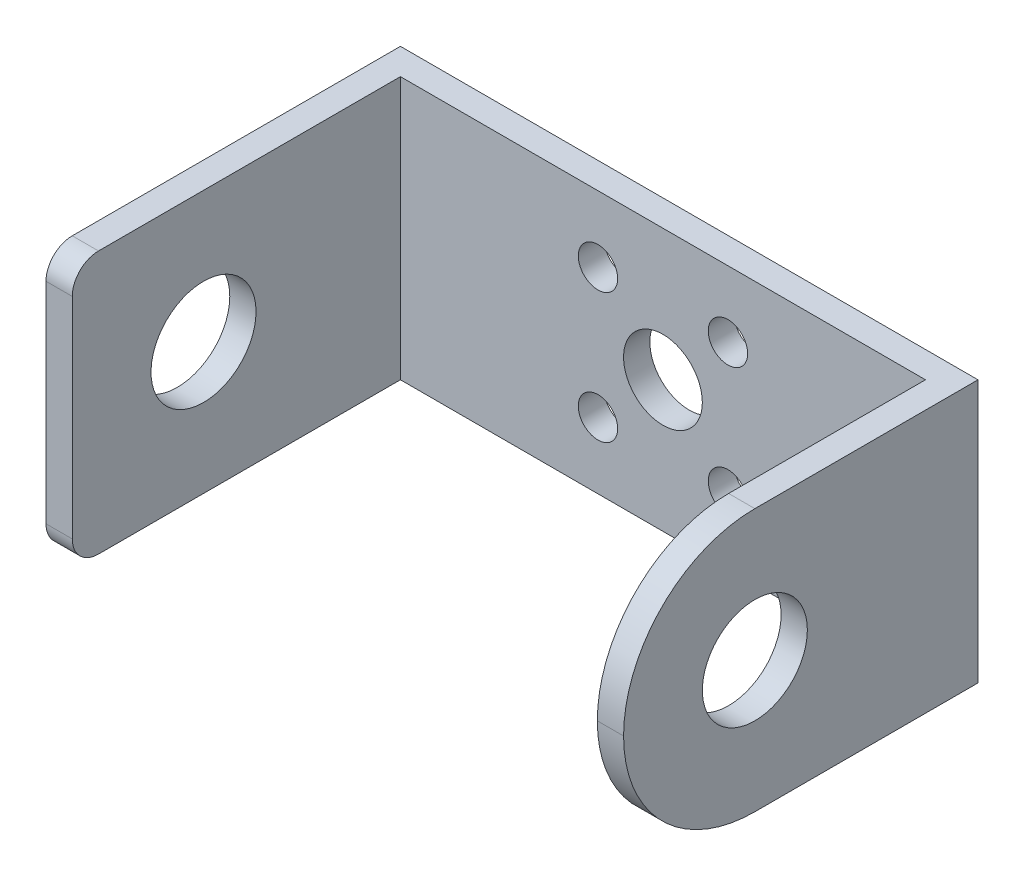
ISO-10303-21;
HEADER;
FILE_DESCRIPTION(('STEP AP214'),'2;1');
FILE_NAME('part.step','',(''),(''),'','','');
FILE_SCHEMA(('AUTOMOTIVE_DESIGN { 1 0 10303 214 1 1 1 1 }'));
ENDSEC;
DATA;
#1=APPLICATION_CONTEXT('core data for automotive mechanical design processes');
#2=APPLICATION_PROTOCOL_DEFINITION('international standard','automotive_design',2000,#1);
#3=PRODUCT_CONTEXT('',#1,'mechanical');
#4=PRODUCT('Part','Part','',(#3));
#5=PRODUCT_RELATED_PRODUCT_CATEGORY('part','',(#4));
#6=PRODUCT_DEFINITION_FORMATION('','',#4);
#7=PRODUCT_DEFINITION_CONTEXT('part definition',#1,'design');
#8=PRODUCT_DEFINITION('design','',#6,#7);
#9=PRODUCT_DEFINITION_SHAPE('','',#8);
#10=(LENGTH_UNIT() NAMED_UNIT(*) SI_UNIT(.MILLI.,.METRE.));
#11=(NAMED_UNIT(*) PLANE_ANGLE_UNIT() SI_UNIT($,.RADIAN.));
#12=(NAMED_UNIT(*) SI_UNIT($,.STERADIAN.) SOLID_ANGLE_UNIT());
#13=UNCERTAINTY_MEASURE_WITH_UNIT(LENGTH_MEASURE(1.E-05),#10,'distance_accuracy_value','');
#14=(GEOMETRIC_REPRESENTATION_CONTEXT(3) GLOBAL_UNCERTAINTY_ASSIGNED_CONTEXT((#13)) GLOBAL_UNIT_ASSIGNED_CONTEXT((#10,
#11,#12)) REPRESENTATION_CONTEXT('',''));
#15=CARTESIAN_POINT('',(0.,0.,0.));
#16=DIRECTION('',(0.,0.,1.));
#17=DIRECTION('',(1.,0.,0.));
#18=AXIS2_PLACEMENT_3D('',#15,#16,#17);
#19=CARTESIAN_POINT('',(0.,0.,2.));
#20=DIRECTION('',(0.,0.,-1.));
#21=DIRECTION('',(-1.,0.,0.));
#22=AXIS2_PLACEMENT_3D('',#19,#20,#21);
#23=PLANE('',#22);
#24=CARTESIAN_POINT('',(-4.94974746830583,-4.94974746830584,2.));
#25=DIRECTION('',(0.,0.,1.));
#26=DIRECTION('',(-1.,0.,0.));
#27=AXIS2_PLACEMENT_3D('',#24,#25,#26);
#28=CIRCLE('',#27,1.5);
#29=CARTESIAN_POINT('',(-6.44974746830583,-4.94974746830584,2.));
#30=VERTEX_POINT('',#29);
#31=EDGE_CURVE('E147',#30,#30,#28,.T.);
#32=ORIENTED_EDGE('',*,*,#31,.F.);
#33=EDGE_LOOP('',(#32));
#34=FACE_BOUND('',#33,.T.);
#35=CARTESIAN_POINT('',(4.94974746830582,-4.94974746830584,2.));
#36=DIRECTION('',(0.,0.,1.));
#37=DIRECTION('',(1.,0.,0.));
#38=AXIS2_PLACEMENT_3D('',#35,#36,#37);
#39=CIRCLE('',#38,1.5);
#40=CARTESIAN_POINT('',(6.44974746830582,-4.94974746830584,2.));
#41=VERTEX_POINT('',#40);
#42=EDGE_CURVE('E164',#41,#41,#39,.T.);
#43=ORIENTED_EDGE('',*,*,#42,.F.);
#44=EDGE_LOOP('',(#43));
#45=FACE_BOUND('',#44,.T.);
#46=CARTESIAN_POINT('',(4.94974746830582,4.94974746830583,2.));
#47=DIRECTION('',(0.,0.,1.));
#48=DIRECTION('',(-1.,0.,0.));
#49=AXIS2_PLACEMENT_3D('',#46,#47,#48);
#50=CIRCLE('',#49,1.5);
#51=CARTESIAN_POINT('',(3.44974746830582,4.94974746830583,2.));
#52=VERTEX_POINT('',#51);
#53=EDGE_CURVE('E158',#52,#52,#50,.T.);
#54=ORIENTED_EDGE('',*,*,#53,.F.);
#55=EDGE_LOOP('',(#54));
#56=FACE_BOUND('',#55,.T.);
#57=CARTESIAN_POINT('',(-4.94974746830583,4.94974746830583,2.));
#58=DIRECTION('',(0.,0.,1.));
#59=DIRECTION('',(1.,0.,0.));
#60=AXIS2_PLACEMENT_3D('',#57,#58,#59);
#61=CIRCLE('',#60,1.5);
#62=CARTESIAN_POINT('',(-3.44974746830583,4.94974746830583,2.));
#63=VERTEX_POINT('',#62);
#64=EDGE_CURVE('E152',#63,#63,#61,.T.);
#65=ORIENTED_EDGE('',*,*,#64,.F.);
#66=EDGE_LOOP('',(#65));
#67=FACE_BOUND('',#66,.T.);
#68=CARTESIAN_POINT('',(0.,0.,2.));
#69=DIRECTION('',(0.,0.,1.));
#70=DIRECTION('',(1.,0.,0.));
#71=AXIS2_PLACEMENT_3D('',#68,#69,#70);
#72=CIRCLE('',#71,3.);
#73=CARTESIAN_POINT('',(3.,0.,2.));
#74=VERTEX_POINT('',#73);
#75=EDGE_CURVE('E151',#74,#74,#72,.T.);
#76=ORIENTED_EDGE('',*,*,#75,.F.);
#77=EDGE_LOOP('',(#76));
#78=FACE_BOUND('',#77,.T.);
#79=DIRECTION('',(0.,-1.,0.));
#80=VECTOR('',#79,1.);
#81=CARTESIAN_POINT('',(20.,10.,2.));
#82=LINE('',#81,#80);
#83=CARTESIAN_POINT('',(20.,10.,2.));
#84=VERTEX_POINT('',#83);
#85=CARTESIAN_POINT('',(20.,-10.,2.));
#86=VERTEX_POINT('',#85);
#87=EDGE_CURVE('E132',#84,#86,#82,.T.);
#88=ORIENTED_EDGE('',*,*,#87,.F.);
#89=DIRECTION('',(-1.,0.,0.));
#90=VECTOR('',#89,1.);
#91=CARTESIAN_POINT('',(-22.,10.,2.));
#92=LINE('',#91,#90);
#93=CARTESIAN_POINT('',(-20.,10.,2.));
#94=VERTEX_POINT('',#93);
#95=EDGE_CURVE('E119',#84,#94,#92,.T.);
#96=ORIENTED_EDGE('',*,*,#95,.T.);
#97=DIRECTION('',(0.,1.,0.));
#98=VECTOR('',#97,1.);
#99=CARTESIAN_POINT('',(-20.,10.,2.));
#100=LINE('',#99,#98);
#101=CARTESIAN_POINT('',(-20.,-10.,2.));
#102=VERTEX_POINT('',#101);
#103=EDGE_CURVE('E129',#102,#94,#100,.T.);
#104=ORIENTED_EDGE('',*,*,#103,.F.);
#105=DIRECTION('',(1.,0.,0.));
#106=VECTOR('',#105,1.);
#107=CARTESIAN_POINT('',(-22.,-10.,2.));
#108=LINE('',#107,#106);
#109=EDGE_CURVE('E133',#102,#86,#108,.T.);
#110=ORIENTED_EDGE('',*,*,#109,.T.);
#111=EDGE_LOOP('',(#88,#96,#104,#110));
#112=FACE_BOUND('',#111,.T.);
#113=ADVANCED_FACE('F33',(#34,#45,#56,#67,#78,#112),#23,.F.);
#114=CARTESIAN_POINT('',(22.,-10.,2.));
#115=DIRECTION('',(-1.,0.,0.));
#116=DIRECTION('',(0.,0.,1.));
#117=AXIS2_PLACEMENT_3D('',#114,#115,#116);
#118=PLANE('',#117);
#119=CARTESIAN_POINT('',(22.,0.,17.));
#120=DIRECTION('',(1.,0.,0.));
#121=DIRECTION('',(0.,0.,-1.));
#122=AXIS2_PLACEMENT_3D('',#119,#120,#121);
#123=CIRCLE('',#122,4.);
#124=CARTESIAN_POINT('',(22.,0.,13.));
#125=VERTEX_POINT('',#124);
#126=EDGE_CURVE('E261',#125,#125,#123,.T.);
#127=ORIENTED_EDGE('',*,*,#126,.F.);
#128=EDGE_LOOP('',(#127));
#129=FACE_BOUND('',#128,.T.);
#130=DIRECTION('',(0.,0.,-1.));
#131=VECTOR('',#130,1.);
#132=CARTESIAN_POINT('',(22.,10.,2.));
#133=LINE('',#132,#131);
#134=CARTESIAN_POINT('',(22.,10.,17.));
#135=VERTEX_POINT('',#134);
#136=CARTESIAN_POINT('',(22.,10.,0.));
#137=VERTEX_POINT('',#136);
#138=EDGE_CURVE('E195',#135,#137,#133,.T.);
#139=ORIENTED_EDGE('',*,*,#138,.F.);
#140=CARTESIAN_POINT('',(22.,0.,17.));
#141=DIRECTION('',(-1.,0.,0.));
#142=DIRECTION('',(0.,0.,1.));
#143=AXIS2_PLACEMENT_3D('',#140,#141,#142);
#144=CIRCLE('',#143,10.);
#145=CARTESIAN_POINT('',(22.,0.,27.));
#146=VERTEX_POINT('',#145);
#147=EDGE_CURVE('E206',#135,#146,#144,.F.);
#148=ORIENTED_EDGE('',*,*,#147,.T.);
#149=CARTESIAN_POINT('',(22.,0.,17.));
#150=DIRECTION('',(-1.,0.,0.));
#151=DIRECTION('',(0.,0.,1.));
#152=AXIS2_PLACEMENT_3D('',#149,#150,#151);
#153=CIRCLE('',#152,10.);
#154=CARTESIAN_POINT('',(22.,-10.,17.));
#155=VERTEX_POINT('',#154);
#156=EDGE_CURVE('E204',#146,#155,#153,.F.);
#157=ORIENTED_EDGE('',*,*,#156,.T.);
#158=DIRECTION('',(0.,0.,-1.));
#159=VECTOR('',#158,1.);
#160=CARTESIAN_POINT('',(22.,-10.,2.));
#161=LINE('',#160,#159);
#162=CARTESIAN_POINT('',(22.,-10.,0.));
#163=VERTEX_POINT('',#162);
#164=EDGE_CURVE('E179',#155,#163,#161,.T.);
#165=ORIENTED_EDGE('',*,*,#164,.T.);
#166=DIRECTION('',(0.,1.,0.));
#167=VECTOR('',#166,1.);
#168=CARTESIAN_POINT('',(22.,-10.,0.));
#169=LINE('',#168,#167);
#170=EDGE_CURVE('E175',#163,#137,#169,.T.);
#171=ORIENTED_EDGE('',*,*,#170,.T.);
#172=EDGE_LOOP('',(#139,#148,#157,#165,#171));
#173=FACE_BOUND('',#172,.T.);
#174=ADVANCED_FACE('F268',(#129,#173),#118,.F.);
#175=CARTESIAN_POINT('',(-22.,10.,2.));
#176=DIRECTION('',(0.,-1.,0.));
#177=DIRECTION('',(0.,0.,-1.));
#178=AXIS2_PLACEMENT_3D('',#175,#176,#177);
#179=PLANE('',#178);
#180=DIRECTION('',(0.,0.,-1.));
#181=VECTOR('',#180,1.);
#182=CARTESIAN_POINT('',(-22.,10.,2.));
#183=LINE('',#182,#181);
#184=CARTESIAN_POINT('',(-22.,10.,25.));
#185=VERTEX_POINT('',#184);
#186=CARTESIAN_POINT('',(-22.,10.,0.));
#187=VERTEX_POINT('',#186);
#188=EDGE_CURVE('E193',#185,#187,#183,.T.);
#189=ORIENTED_EDGE('',*,*,#188,.F.);
#190=DIRECTION('',(-1.,0.,0.));
#191=VECTOR('',#190,1.);
#192=CARTESIAN_POINT('',(-20.,10.,25.));
#193=LINE('',#192,#191);
#194=CARTESIAN_POINT('',(-20.,10.,25.));
#195=VERTEX_POINT('',#194);
#196=EDGE_CURVE('E57',#185,#195,#193,.F.);
#197=ORIENTED_EDGE('',*,*,#196,.T.);
#198=DIRECTION('',(0.,0.,-1.));
#199=VECTOR('',#198,1.);
#200=CARTESIAN_POINT('',(-20.,10.,27.));
#201=LINE('',#200,#199);
#202=EDGE_CURVE('E115',#195,#94,#201,.T.);
#203=ORIENTED_EDGE('',*,*,#202,.T.);
#204=ORIENTED_EDGE('',*,*,#95,.F.);
#205=DIRECTION('',(0.,0.,-1.));
#206=VECTOR('',#205,1.);
#207=CARTESIAN_POINT('',(20.,10.,27.));
#208=LINE('',#207,#206);
#209=CARTESIAN_POINT('',(20.,10.,17.));
#210=VERTEX_POINT('',#209);
#211=EDGE_CURVE('E138',#210,#84,#208,.T.);
#212=ORIENTED_EDGE('',*,*,#211,.F.);
#213=DIRECTION('',(-1.,0.,0.));
#214=VECTOR('',#213,1.);
#215=CARTESIAN_POINT('',(-22.,10.,17.));
#216=LINE('',#215,#214);
#217=EDGE_CURVE('E201',#210,#135,#216,.F.);
#218=ORIENTED_EDGE('',*,*,#217,.T.);
#219=ORIENTED_EDGE('',*,*,#138,.T.);
#220=DIRECTION('',(-1.,0.,0.));
#221=VECTOR('',#220,1.);
#222=CARTESIAN_POINT('',(-22.,10.,0.));
#223=LINE('',#222,#221);
#224=EDGE_CURVE('E182',#137,#187,#223,.T.);
#225=ORIENTED_EDGE('',*,*,#224,.T.);
#226=EDGE_LOOP('',(#189,#197,#203,#204,#212,#218,#219,#225));
#227=FACE_BOUND('',#226,.T.);
#228=ADVANCED_FACE('F117',(#227),#179,.F.);
#229=CARTESIAN_POINT('',(-22.,-10.,2.));
#230=DIRECTION('',(1.,0.,0.));
#231=DIRECTION('',(0.,0.,-1.));
#232=AXIS2_PLACEMENT_3D('',#229,#230,#231);
#233=PLANE('',#232);
#234=CARTESIAN_POINT('',(-22.,0.,17.));
#235=DIRECTION('',(1.,0.,0.));
#236=DIRECTION('',(0.,0.,-1.));
#237=AXIS2_PLACEMENT_3D('',#234,#235,#236);
#238=CIRCLE('',#237,4.);
#239=CARTESIAN_POINT('',(-22.,0.,13.));
#240=VERTEX_POINT('',#239);
#241=EDGE_CURVE('E258',#240,#240,#238,.F.);
#242=ORIENTED_EDGE('',*,*,#241,.F.);
#243=EDGE_LOOP('',(#242));
#244=FACE_BOUND('',#243,.T.);
#245=DIRECTION('',(0.,-1.,0.));
#246=VECTOR('',#245,1.);
#247=CARTESIAN_POINT('',(-22.,10.,27.));
#248=LINE('',#247,#246);
#249=CARTESIAN_POINT('',(-22.,8.,27.));
#250=VERTEX_POINT('',#249);
#251=CARTESIAN_POINT('',(-22.,-8.,27.));
#252=VERTEX_POINT('',#251);
#253=EDGE_CURVE('E137',#250,#252,#248,.T.);
#254=ORIENTED_EDGE('',*,*,#253,.F.);
#255=CARTESIAN_POINT('',(-22.,8.,25.));
#256=DIRECTION('',(1.,0.,0.));
#257=DIRECTION('',(0.,0.,-1.));
#258=AXIS2_PLACEMENT_3D('',#255,#256,#257);
#259=CIRCLE('',#258,2.);
#260=EDGE_CURVE('E222',#250,#185,#259,.F.);
#261=ORIENTED_EDGE('',*,*,#260,.T.);
#262=ORIENTED_EDGE('',*,*,#188,.T.);
#263=DIRECTION('',(0.,-1.,0.));
#264=VECTOR('',#263,1.);
#265=CARTESIAN_POINT('',(-22.,-10.,0.));
#266=LINE('',#265,#264);
#267=CARTESIAN_POINT('',(-22.,-10.,0.));
#268=VERTEX_POINT('',#267);
#269=EDGE_CURVE('E185',#187,#268,#266,.T.);
#270=ORIENTED_EDGE('',*,*,#269,.T.);
#271=DIRECTION('',(0.,0.,-1.));
#272=VECTOR('',#271,1.);
#273=CARTESIAN_POINT('',(-22.,-10.,2.));
#274=LINE('',#273,#272);
#275=CARTESIAN_POINT('',(-22.,-10.,25.));
#276=VERTEX_POINT('',#275);
#277=EDGE_CURVE('E191',#276,#268,#274,.T.);
#278=ORIENTED_EDGE('',*,*,#277,.F.);
#279=CARTESIAN_POINT('',(-22.,-8.,25.));
#280=DIRECTION('',(1.,0.,0.));
#281=DIRECTION('',(0.,0.,-1.));
#282=AXIS2_PLACEMENT_3D('',#279,#280,#281);
#283=CIRCLE('',#282,2.);
#284=EDGE_CURVE('E220',#276,#252,#283,.F.);
#285=ORIENTED_EDGE('',*,*,#284,.T.);
#286=EDGE_LOOP('',(#254,#261,#262,#270,#278,#285));
#287=FACE_BOUND('',#286,.T.);
#288=ADVANCED_FACE('F235',(#244,#287),#233,.F.);
#289=CARTESIAN_POINT('',(-22.,-10.,2.));
#290=DIRECTION('',(0.,1.,0.));
#291=DIRECTION('',(0.,0.,1.));
#292=AXIS2_PLACEMENT_3D('',#289,#290,#291);
#293=PLANE('',#292);
#294=DIRECTION('',(0.,0.,-1.));
#295=VECTOR('',#294,1.);
#296=CARTESIAN_POINT('',(-20.,-10.,27.));
#297=LINE('',#296,#295);
#298=CARTESIAN_POINT('',(-20.,-10.,25.));
#299=VERTEX_POINT('',#298);
#300=EDGE_CURVE('E122',#299,#102,#297,.T.);
#301=ORIENTED_EDGE('',*,*,#300,.F.);
#302=DIRECTION('',(1.,0.,0.));
#303=VECTOR('',#302,1.);
#304=CARTESIAN_POINT('',(-22.,-10.,25.));
#305=LINE('',#304,#303);
#306=EDGE_CURVE('E11',#299,#276,#305,.F.);
#307=ORIENTED_EDGE('',*,*,#306,.T.);
#308=ORIENTED_EDGE('',*,*,#277,.T.);
#309=DIRECTION('',(1.,0.,0.));
#310=VECTOR('',#309,1.);
#311=CARTESIAN_POINT('',(-22.,-10.,0.));
#312=LINE('',#311,#310);
#313=EDGE_CURVE('E134',#268,#163,#312,.T.);
#314=ORIENTED_EDGE('',*,*,#313,.T.);
#315=ORIENTED_EDGE('',*,*,#164,.F.);
#316=DIRECTION('',(1.,0.,0.));
#317=VECTOR('',#316,1.);
#318=CARTESIAN_POINT('',(-22.,-10.,17.));
#319=LINE('',#318,#317);
#320=CARTESIAN_POINT('',(20.,-10.,17.));
#321=VERTEX_POINT('',#320);
#322=EDGE_CURVE('E208',#155,#321,#319,.F.);
#323=ORIENTED_EDGE('',*,*,#322,.T.);
#324=DIRECTION('',(0.,0.,-1.));
#325=VECTOR('',#324,1.);
#326=CARTESIAN_POINT('',(20.,-10.,27.));
#327=LINE('',#326,#325);
#328=EDGE_CURVE('E142',#321,#86,#327,.T.);
#329=ORIENTED_EDGE('',*,*,#328,.T.);
#330=ORIENTED_EDGE('',*,*,#109,.F.);
#331=EDGE_LOOP('',(#301,#307,#308,#314,#315,#323,#329,#330));
#332=FACE_BOUND('',#331,.T.);
#333=ADVANCED_FACE('F248',(#332),#293,.F.);
#334=CARTESIAN_POINT('',(0.,0.,0.));
#335=DIRECTION('',(0.,0.,-1.));
#336=DIRECTION('',(-1.,0.,0.));
#337=AXIS2_PLACEMENT_3D('',#334,#335,#336);
#338=PLANE('',#337);
#339=CARTESIAN_POINT('',(-4.94974746830583,-4.94974746830584,0.));
#340=DIRECTION('',(0.,0.,1.));
#341=DIRECTION('',(-1.,0.,0.));
#342=AXIS2_PLACEMENT_3D('',#339,#340,#341);
#343=CIRCLE('',#342,1.5);
#344=CARTESIAN_POINT('',(-6.44974746830583,-4.94974746830584,0.));
#345=VERTEX_POINT('',#344);
#346=EDGE_CURVE('E167',#345,#345,#343,.T.);
#347=ORIENTED_EDGE('',*,*,#346,.T.);
#348=EDGE_LOOP('',(#347));
#349=FACE_BOUND('',#348,.T.);
#350=CARTESIAN_POINT('',(4.94974746830582,-4.94974746830584,0.));
#351=DIRECTION('',(0.,0.,1.));
#352=DIRECTION('',(1.,0.,0.));
#353=AXIS2_PLACEMENT_3D('',#350,#351,#352);
#354=CIRCLE('',#353,1.5);
#355=CARTESIAN_POINT('',(6.44974746830582,-4.94974746830584,0.));
#356=VERTEX_POINT('',#355);
#357=EDGE_CURVE('E161',#356,#356,#354,.T.);
#358=ORIENTED_EDGE('',*,*,#357,.T.);
#359=EDGE_LOOP('',(#358));
#360=FACE_BOUND('',#359,.T.);
#361=CARTESIAN_POINT('',(4.94974746830582,4.94974746830583,0.));
#362=DIRECTION('',(0.,0.,1.));
#363=DIRECTION('',(-1.,0.,0.));
#364=AXIS2_PLACEMENT_3D('',#361,#362,#363);
#365=CIRCLE('',#364,1.5);
#366=CARTESIAN_POINT('',(3.44974746830582,4.94974746830583,0.));
#367=VERTEX_POINT('',#366);
#368=EDGE_CURVE('E155',#367,#367,#365,.T.);
#369=ORIENTED_EDGE('',*,*,#368,.T.);
#370=EDGE_LOOP('',(#369));
#371=FACE_BOUND('',#370,.T.);
#372=CARTESIAN_POINT('',(-4.94974746830583,4.94974746830583,0.));
#373=DIRECTION('',(0.,0.,1.));
#374=DIRECTION('',(1.,0.,0.));
#375=AXIS2_PLACEMENT_3D('',#372,#373,#374);
#376=CIRCLE('',#375,1.5);
#377=CARTESIAN_POINT('',(-3.44974746830583,4.94974746830583,0.));
#378=VERTEX_POINT('',#377);
#379=EDGE_CURVE('E148',#378,#378,#376,.T.);
#380=ORIENTED_EDGE('',*,*,#379,.T.);
#381=EDGE_LOOP('',(#380));
#382=FACE_BOUND('',#381,.T.);
#383=CARTESIAN_POINT('',(0.,0.,0.));
#384=DIRECTION('',(0.,0.,1.));
#385=DIRECTION('',(1.,0.,0.));
#386=AXIS2_PLACEMENT_3D('',#383,#384,#385);
#387=CIRCLE('',#386,3.);
#388=CARTESIAN_POINT('',(3.,0.,0.));
#389=VERTEX_POINT('',#388);
#390=EDGE_CURVE('E172',#389,#389,#387,.T.);
#391=ORIENTED_EDGE('',*,*,#390,.T.);
#392=EDGE_LOOP('',(#391));
#393=FACE_BOUND('',#392,.T.);
#394=ORIENTED_EDGE('',*,*,#170,.F.);
#395=ORIENTED_EDGE('',*,*,#313,.F.);
#396=ORIENTED_EDGE('',*,*,#269,.F.);
#397=ORIENTED_EDGE('',*,*,#224,.F.);
#398=EDGE_LOOP('',(#394,#395,#396,#397));
#399=FACE_BOUND('',#398,.T.);
#400=ADVANCED_FACE('F242',(#349,#360,#371,#382,#393,#399),#338,.T.);
#401=CARTESIAN_POINT('',(0.,0.,0.));
#402=DIRECTION('',(0.,0.,1.));
#403=DIRECTION('',(1.,0.,0.));
#404=AXIS2_PLACEMENT_3D('',#401,#402,#403);
#405=CYLINDRICAL_SURFACE('',#404,3.);
#406=ORIENTED_EDGE('',*,*,#390,.F.);
#407=EDGE_LOOP('',(#406));
#408=FACE_BOUND('',#407,.T.);
#409=ORIENTED_EDGE('',*,*,#75,.T.);
#410=EDGE_LOOP('',(#409));
#411=FACE_BOUND('',#410,.T.);
#412=ADVANCED_FACE('F298',(#408,#411),#405,.F.);
#413=CARTESIAN_POINT('',(-4.94974746830583,4.94974746830583,0.));
#414=DIRECTION('',(0.,0.,1.));
#415=DIRECTION('',(1.,0.,0.));
#416=AXIS2_PLACEMENT_3D('',#413,#414,#415);
#417=CYLINDRICAL_SURFACE('',#416,1.5);
#418=ORIENTED_EDGE('',*,*,#379,.F.);
#419=EDGE_LOOP('',(#418));
#420=FACE_BOUND('',#419,.T.);
#421=ORIENTED_EDGE('',*,*,#64,.T.);
#422=EDGE_LOOP('',(#421));
#423=FACE_BOUND('',#422,.T.);
#424=ADVANCED_FACE('F333',(#420,#423),#417,.F.);
#425=CARTESIAN_POINT('',(4.94974746830582,4.94974746830583,0.));
#426=DIRECTION('',(0.,0.,1.));
#427=DIRECTION('',(1.,0.,0.));
#428=AXIS2_PLACEMENT_3D('',#425,#426,#427);
#429=CYLINDRICAL_SURFACE('',#428,1.5);
#430=ORIENTED_EDGE('',*,*,#368,.F.);
#431=EDGE_LOOP('',(#430));
#432=FACE_BOUND('',#431,.T.);
#433=ORIENTED_EDGE('',*,*,#53,.T.);
#434=EDGE_LOOP('',(#433));
#435=FACE_BOUND('',#434,.T.);
#436=ADVANCED_FACE('F340',(#432,#435),#429,.F.);
#437=CARTESIAN_POINT('',(4.94974746830582,-4.94974746830584,0.));
#438=DIRECTION('',(0.,0.,1.));
#439=DIRECTION('',(1.,0.,0.));
#440=AXIS2_PLACEMENT_3D('',#437,#438,#439);
#441=CYLINDRICAL_SURFACE('',#440,1.5);
#442=ORIENTED_EDGE('',*,*,#357,.F.);
#443=EDGE_LOOP('',(#442));
#444=FACE_BOUND('',#443,.T.);
#445=ORIENTED_EDGE('',*,*,#42,.T.);
#446=EDGE_LOOP('',(#445));
#447=FACE_BOUND('',#446,.T.);
#448=ADVANCED_FACE('F348',(#444,#447),#441,.F.);
#449=CARTESIAN_POINT('',(-4.94974746830583,-4.94974746830584,0.));
#450=DIRECTION('',(0.,0.,1.));
#451=DIRECTION('',(1.,0.,0.));
#452=AXIS2_PLACEMENT_3D('',#449,#450,#451);
#453=CYLINDRICAL_SURFACE('',#452,1.5);
#454=ORIENTED_EDGE('',*,*,#346,.F.);
#455=EDGE_LOOP('',(#454));
#456=FACE_BOUND('',#455,.T.);
#457=ORIENTED_EDGE('',*,*,#31,.T.);
#458=EDGE_LOOP('',(#457));
#459=FACE_BOUND('',#458,.T.);
#460=ADVANCED_FACE('F356',(#456,#459),#453,.F.);
#461=CARTESIAN_POINT('',(-20.,10.,27.));
#462=DIRECTION('',(-1.,0.,0.));
#463=DIRECTION('',(0.,-1.,0.));
#464=AXIS2_PLACEMENT_3D('',#461,#462,#463);
#465=PLANE('',#464);
#466=CARTESIAN_POINT('',(-20.,0.,17.));
#467=DIRECTION('',(-1.,0.,0.));
#468=DIRECTION('',(0.,-1.,0.));
#469=AXIS2_PLACEMENT_3D('',#466,#467,#468);
#470=CIRCLE('',#469,4.);
#471=CARTESIAN_POINT('',(-20.,-4.,17.));
#472=VERTEX_POINT('',#471);
#473=EDGE_CURVE('E214',#472,#472,#470,.T.);
#474=ORIENTED_EDGE('',*,*,#473,.T.);
#475=EDGE_LOOP('',(#474));
#476=FACE_BOUND('',#475,.T.);
#477=ORIENTED_EDGE('',*,*,#202,.F.);
#478=CARTESIAN_POINT('',(-20.,8.,25.));
#479=DIRECTION('',(-1.,0.,0.));
#480=DIRECTION('',(0.,-1.,0.));
#481=AXIS2_PLACEMENT_3D('',#478,#479,#480);
#482=CIRCLE('',#481,2.);
#483=CARTESIAN_POINT('',(-20.,8.,27.));
#484=VERTEX_POINT('',#483);
#485=EDGE_CURVE('E42',#195,#484,#482,.F.);
#486=ORIENTED_EDGE('',*,*,#485,.T.);
#487=DIRECTION('',(0.,1.,0.));
#488=VECTOR('',#487,1.);
#489=CARTESIAN_POINT('',(-20.,10.,27.));
#490=LINE('',#489,#488);
#491=CARTESIAN_POINT('',(-20.,-8.,27.));
#492=VERTEX_POINT('',#491);
#493=EDGE_CURVE('E123',#492,#484,#490,.T.);
#494=ORIENTED_EDGE('',*,*,#493,.F.);
#495=CARTESIAN_POINT('',(-20.,-8.,25.));
#496=DIRECTION('',(-1.,0.,0.));
#497=DIRECTION('',(0.,-1.,0.));
#498=AXIS2_PLACEMENT_3D('',#495,#496,#497);
#499=CIRCLE('',#498,2.);
#500=EDGE_CURVE('E49',#492,#299,#499,.F.);
#501=ORIENTED_EDGE('',*,*,#500,.T.);
#502=ORIENTED_EDGE('',*,*,#300,.T.);
#503=ORIENTED_EDGE('',*,*,#103,.T.);
#504=EDGE_LOOP('',(#477,#486,#494,#501,#502,#503));
#505=FACE_BOUND('',#504,.T.);
#506=ADVANCED_FACE('F136',(#476,#505),#465,.F.);
#507=CARTESIAN_POINT('',(0.,0.,27.));
#508=DIRECTION('',(0.,0.,1.));
#509=DIRECTION('',(1.,0.,0.));
#510=AXIS2_PLACEMENT_3D('',#507,#508,#509);
#511=PLANE('',#510);
#512=ORIENTED_EDGE('',*,*,#493,.T.);
#513=DIRECTION('',(-1.,0.,0.));
#514=VECTOR('',#513,1.);
#515=CARTESIAN_POINT('',(-22.,8.,27.));
#516=LINE('',#515,#514);
#517=EDGE_CURVE('E217',#484,#250,#516,.T.);
#518=ORIENTED_EDGE('',*,*,#517,.T.);
#519=ORIENTED_EDGE('',*,*,#253,.T.);
#520=DIRECTION('',(1.,0.,0.));
#521=VECTOR('',#520,1.);
#522=CARTESIAN_POINT('',(-20.,-8.,27.));
#523=LINE('',#522,#521);
#524=EDGE_CURVE('E210',#252,#492,#523,.T.);
#525=ORIENTED_EDGE('',*,*,#524,.T.);
#526=EDGE_LOOP('',(#512,#518,#519,#525));
#527=FACE_BOUND('',#526,.T.);
#528=ADVANCED_FACE('F230',(#527),#511,.T.);
#529=CARTESIAN_POINT('',(20.,10.,27.));
#530=DIRECTION('',(1.,0.,0.));
#531=DIRECTION('',(0.,0.,-1.));
#532=AXIS2_PLACEMENT_3D('',#529,#530,#531);
#533=PLANE('',#532);
#534=CARTESIAN_POINT('',(20.,0.,17.));
#535=DIRECTION('',(1.,0.,0.));
#536=DIRECTION('',(0.,0.,-1.));
#537=AXIS2_PLACEMENT_3D('',#534,#535,#536);
#538=CIRCLE('',#537,4.);
#539=CARTESIAN_POINT('',(20.,0.,13.));
#540=VERTEX_POINT('',#539);
#541=EDGE_CURVE('E37',#540,#540,#538,.T.);
#542=ORIENTED_EDGE('',*,*,#541,.T.);
#543=EDGE_LOOP('',(#542));
#544=FACE_BOUND('',#543,.T.);
#545=CARTESIAN_POINT('',(20.,0.,17.));
#546=DIRECTION('',(1.,0.,0.));
#547=DIRECTION('',(0.,0.,-1.));
#548=AXIS2_PLACEMENT_3D('',#545,#546,#547);
#549=CIRCLE('',#548,10.);
#550=CARTESIAN_POINT('',(20.,0.,27.));
#551=VERTEX_POINT('',#550);
#552=EDGE_CURVE('E197',#321,#551,#549,.F.);
#553=ORIENTED_EDGE('',*,*,#552,.T.);
#554=CARTESIAN_POINT('',(20.,0.,17.));
#555=DIRECTION('',(1.,0.,0.));
#556=DIRECTION('',(0.,0.,-1.));
#557=AXIS2_PLACEMENT_3D('',#554,#555,#556);
#558=CIRCLE('',#557,10.);
#559=EDGE_CURVE('E199',#551,#210,#558,.F.);
#560=ORIENTED_EDGE('',*,*,#559,.T.);
#561=ORIENTED_EDGE('',*,*,#211,.T.);
#562=ORIENTED_EDGE('',*,*,#87,.T.);
#563=ORIENTED_EDGE('',*,*,#328,.F.);
#564=EDGE_LOOP('',(#553,#560,#561,#562,#563));
#565=FACE_BOUND('',#564,.T.);
#566=ADVANCED_FACE('F251',(#544,#565),#533,.F.);
#567=CARTESIAN_POINT('',(0.,0.,17.));
#568=DIRECTION('',(1.,0.,0.));
#569=DIRECTION('',(0.,0.,-1.));
#570=AXIS2_PLACEMENT_3D('',#567,#568,#569);
#571=CYLINDRICAL_SURFACE('',#570,10.);
#572=ORIENTED_EDGE('',*,*,#322,.F.);
#573=ORIENTED_EDGE('',*,*,#156,.F.);
#574=DIRECTION('',(1.,0.,0.));
#575=VECTOR('',#574,1.);
#576=CARTESIAN_POINT('',(0.,0.,27.));
#577=LINE('',#576,#575);
#578=EDGE_CURVE('E211',#551,#146,#577,.T.);
#579=ORIENTED_EDGE('',*,*,#578,.F.);
#580=ORIENTED_EDGE('',*,*,#552,.F.);
#581=EDGE_LOOP('',(#572,#573,#579,#580));
#582=FACE_BOUND('',#581,.T.);
#583=ADVANCED_FACE('F276',(#582),#571,.T.);
#584=CARTESIAN_POINT('',(0.,0.,17.));
#585=DIRECTION('',(-1.,0.,0.));
#586=DIRECTION('',(0.,0.,1.));
#587=AXIS2_PLACEMENT_3D('',#584,#585,#586);
#588=CYLINDRICAL_SURFACE('',#587,10.);
#589=ORIENTED_EDGE('',*,*,#147,.F.);
#590=ORIENTED_EDGE('',*,*,#217,.F.);
#591=ORIENTED_EDGE('',*,*,#559,.F.);
#592=ORIENTED_EDGE('',*,*,#578,.T.);
#593=EDGE_LOOP('',(#589,#590,#591,#592));
#594=FACE_BOUND('',#593,.T.);
#595=ADVANCED_FACE('F281',(#594),#588,.T.);
#596=CARTESIAN_POINT('',(0.,8.,25.));
#597=DIRECTION('',(1.,0.,0.));
#598=DIRECTION('',(0.,0.,-1.));
#599=AXIS2_PLACEMENT_3D('',#596,#597,#598);
#600=CYLINDRICAL_SURFACE('',#599,2.);
#601=ORIENTED_EDGE('',*,*,#485,.F.);
#602=ORIENTED_EDGE('',*,*,#196,.F.);
#603=ORIENTED_EDGE('',*,*,#260,.F.);
#604=ORIENTED_EDGE('',*,*,#517,.F.);
#605=EDGE_LOOP('',(#601,#602,#603,#604));
#606=FACE_BOUND('',#605,.T.);
#607=ADVANCED_FACE('F233',(#606),#600,.T.);
#608=CARTESIAN_POINT('',(0.,-8.,25.));
#609=DIRECTION('',(-1.,0.,0.));
#610=DIRECTION('',(0.,0.,1.));
#611=AXIS2_PLACEMENT_3D('',#608,#609,#610);
#612=CYLINDRICAL_SURFACE('',#611,2.);
#613=ORIENTED_EDGE('',*,*,#284,.F.);
#614=ORIENTED_EDGE('',*,*,#306,.F.);
#615=ORIENTED_EDGE('',*,*,#500,.F.);
#616=ORIENTED_EDGE('',*,*,#524,.F.);
#617=EDGE_LOOP('',(#613,#614,#615,#616));
#618=FACE_BOUND('',#617,.T.);
#619=ADVANCED_FACE('F35',(#618),#612,.T.);
#620=CARTESIAN_POINT('',(-33.3137084989848,0.,17.));
#621=DIRECTION('',(1.,0.,0.));
#622=DIRECTION('',(0.,0.,-1.));
#623=AXIS2_PLACEMENT_3D('',#620,#621,#622);
#624=CYLINDRICAL_SURFACE('',#623,4.);
#625=ORIENTED_EDGE('',*,*,#126,.T.);
#626=EDGE_LOOP('',(#625));
#627=FACE_BOUND('',#626,.T.);
#628=ORIENTED_EDGE('',*,*,#541,.F.);
#629=EDGE_LOOP('',(#628));
#630=FACE_BOUND('',#629,.T.);
#631=ADVANCED_FACE('F265',(#627,#630),#624,.F.);
#632=ORIENTED_EDGE('',*,*,#241,.T.);
#633=EDGE_LOOP('',(#632));
#634=FACE_BOUND('',#633,.T.);
#635=ORIENTED_EDGE('',*,*,#473,.F.);
#636=EDGE_LOOP('',(#635));
#637=FACE_BOUND('',#636,.T.);
#638=ADVANCED_FACE('F413',(#634,#637),#624,.F.);
#639=CLOSED_SHELL('',(#113,#174,#228,#288,#333,#400,#412,#424,#436,#448,#460,#506,#528,#566,
#583,#595,#607,#619,#631,#638));
#640=MANIFOLD_SOLID_BREP('B2',#639);
#641=ADVANCED_BREP_SHAPE_REPRESENTATION('',(#18,#640),#14);
#642=SHAPE_DEFINITION_REPRESENTATION(#9,#641);
ENDSEC;
END-ISO-10303-21;
